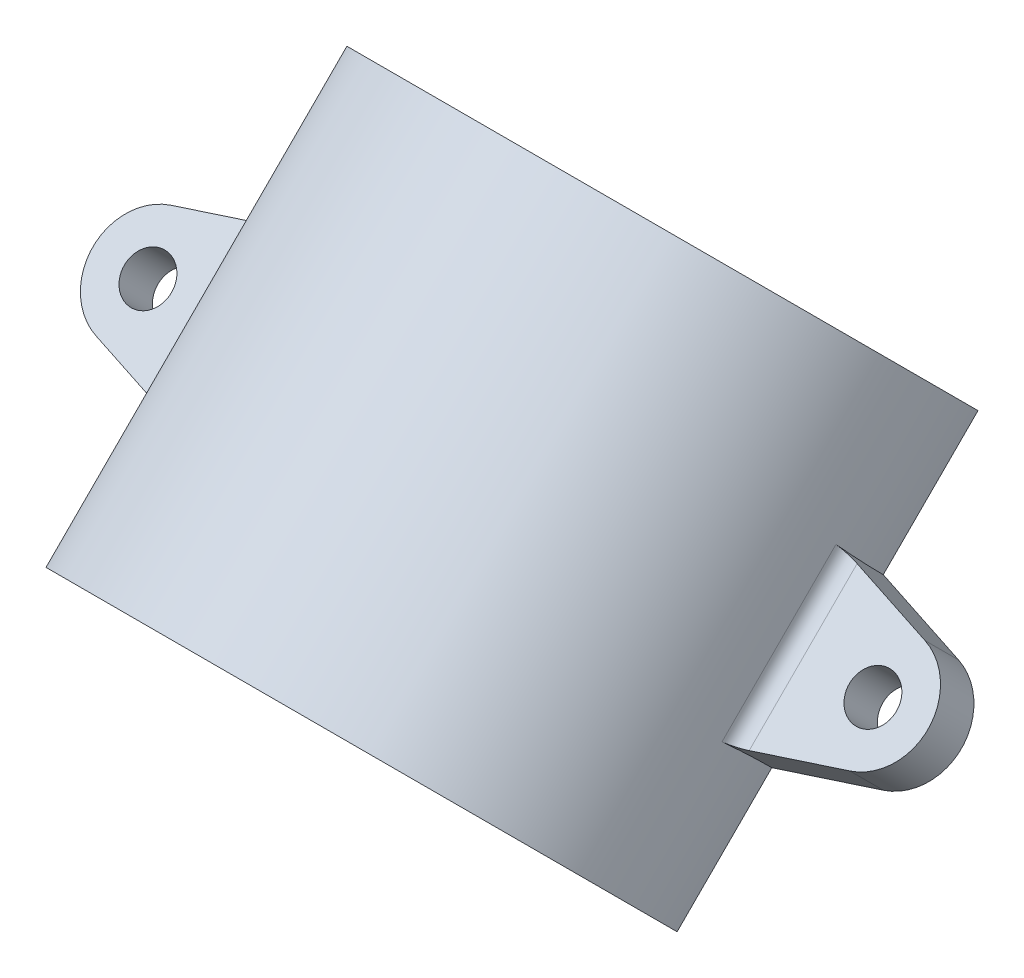
ISO-10303-21;
HEADER;
FILE_DESCRIPTION(('STEP AP214'),'2;1');
FILE_NAME('part.step','',(''),(''),'','','');
FILE_SCHEMA(('AUTOMOTIVE_DESIGN { 1 0 10303 214 1 1 1 1 }'));
ENDSEC;
DATA;
#1=APPLICATION_CONTEXT('core data for automotive mechanical design processes');
#2=APPLICATION_PROTOCOL_DEFINITION('international standard','automotive_design',2000,#1);
#3=PRODUCT_CONTEXT('',#1,'mechanical');
#4=PRODUCT('Part','Part','',(#3));
#5=PRODUCT_RELATED_PRODUCT_CATEGORY('part','',(#4));
#6=PRODUCT_DEFINITION_FORMATION('','',#4);
#7=PRODUCT_DEFINITION_CONTEXT('part definition',#1,'design');
#8=PRODUCT_DEFINITION('design','',#6,#7);
#9=PRODUCT_DEFINITION_SHAPE('','',#8);
#10=(LENGTH_UNIT() NAMED_UNIT(*) SI_UNIT(.MILLI.,.METRE.));
#11=(NAMED_UNIT(*) PLANE_ANGLE_UNIT() SI_UNIT($,.RADIAN.));
#12=(NAMED_UNIT(*) SI_UNIT($,.STERADIAN.) SOLID_ANGLE_UNIT());
#13=UNCERTAINTY_MEASURE_WITH_UNIT(LENGTH_MEASURE(1.E-05),#10,'distance_accuracy_value','');
#14=(GEOMETRIC_REPRESENTATION_CONTEXT(3) GLOBAL_UNCERTAINTY_ASSIGNED_CONTEXT((#13)) GLOBAL_UNIT_ASSIGNED_CONTEXT((#10,
#11,#12)) REPRESENTATION_CONTEXT('',''));
#15=CARTESIAN_POINT('',(0.,0.,0.));
#16=DIRECTION('',(0.,0.,1.));
#17=DIRECTION('',(1.,0.,0.));
#18=AXIS2_PLACEMENT_3D('',#15,#16,#17);
#19=CARTESIAN_POINT('',(73.8446097676777,108.985634114134,75.6415226492367));
#20=DIRECTION('',(0.,0.70710678118655,-0.707106781186545));
#21=DIRECTION('',(0.,0.707106781186545,0.70710678118655));
#22=AXIS2_PLACEMENT_3D('',#19,#20,#21);
#23=CYLINDRICAL_SURFACE('',#22,17.9999999999999);
#24=CARTESIAN_POINT('',(73.8446097676778,154.017195423794,30.6099613395769));
#25=DIRECTION('',(0.264410286372221,-0.681941053339861,0.681941053339862));
#26=DIRECTION('',(0.964410286372227,0.186966306509284,-0.186966306509264));
#27=AXIS2_PLACEMENT_3D('',#24,#25,#26);
#28=ELLIPSE('',#27,18.6642555086276,17.9999999999999);
#29=CARTESIAN_POINT('',(55.844609767678,150.5276085076,34.09954825577));
#30=VERTEX_POINT('',#29);
#31=CARTESIAN_POINT('',(56.2480223372503,153.285379003756,36.7009028380806));
#32=VERTEX_POINT('',#31);
#33=EDGE_CURVE('E144',#30,#32,#28,.F.);
#34=ORIENTED_EDGE('',*,*,#33,.T.);
#35=DIRECTION('',(0.,0.70710678118655,-0.707106781186545));
#36=VECTOR('',#35,1.);
#37=CARTESIAN_POINT('',(56.2480223372503,111.665196653366,78.3210851884696));
#38=LINE('',#37,#36);
#39=CARTESIAN_POINT('',(56.2480223372503,146.057895278045,43.9283865637913));
#40=VERTEX_POINT('',#39);
#41=EDGE_CURVE('E251',#32,#40,#38,.F.);
#42=ORIENTED_EDGE('',*,*,#41,.T.);
#43=CARTESIAN_POINT('',(73.8446097676778,139.966953779541,44.6602029838292));
#44=DIRECTION('',(0.264410286372221,0.681941053339866,-0.681941053339857));
#45=DIRECTION('',(-0.964410286372227,0.186966306509266,-0.186966306509282));
#46=AXIS2_PLACEMENT_3D('',#43,#44,#45);
#47=ELLIPSE('',#46,18.6642555086276,17.9999999999999);
#48=CARTESIAN_POINT('',(55.844609767678,143.456540695734,41.1706160676354));
#49=VERTEX_POINT('',#48);
#50=EDGE_CURVE('E180',#40,#49,#47,.F.);
#51=ORIENTED_EDGE('',*,*,#50,.T.);
#52=DIRECTION('',(0.,0.70710678118655,-0.707106781186545));
#53=VECTOR('',#52,1.);
#54=CARTESIAN_POINT('',(55.8446097676779,108.985634114133,75.6415226492366));
#55=LINE('',#54,#53);
#56=CARTESIAN_POINT('',(55.8446097676779,137.446133055649,47.1810237077214));
#57=VERTEX_POINT('',#56);
#58=EDGE_CURVE('E218',#57,#49,#55,.T.);
#59=ORIENTED_EDGE('',*,*,#58,.F.);
#60=CARTESIAN_POINT('',(73.8446097676778,137.446133055649,47.1810237077214));
#61=DIRECTION('',(0.,0.70710678118655,-0.707106781186545));
#62=DIRECTION('',(0.,0.707106781186545,0.70710678118655));
#63=AXIS2_PLACEMENT_3D('',#60,#61,#62);
#64=CIRCLE('',#63,17.9999999999999);
#65=CARTESIAN_POINT('',(91.8446097676778,137.446133055649,47.1810237077214));
#66=VERTEX_POINT('',#65);
#67=EDGE_CURVE('E220',#66,#57,#64,.F.);
#68=ORIENTED_EDGE('',*,*,#67,.F.);
#69=DIRECTION('',(0.,0.70710678118655,-0.707106781186545));
#70=VECTOR('',#69,1.);
#71=CARTESIAN_POINT('',(91.8446097676778,108.985634114133,75.6415226492367));
#72=LINE('',#71,#70);
#73=CARTESIAN_POINT('',(91.8446097676778,143.456540695735,41.1706160676358));
#74=VERTEX_POINT('',#73);
#75=EDGE_CURVE('E241',#66,#74,#72,.T.);
#76=ORIENTED_EDGE('',*,*,#75,.T.);
#77=CARTESIAN_POINT('',(73.8446097676778,139.966953779541,44.6602029838294));
#78=DIRECTION('',(-0.26441028637223,0.681941053339859,-0.68194105333986));
#79=DIRECTION('',(0.964410286372224,0.186966306509291,-0.186966306509271));
#80=AXIS2_PLACEMENT_3D('',#77,#78,#79);
#81=ELLIPSE('',#80,18.6642555086276,17.9999999999999);
#82=CARTESIAN_POINT('',(91.4411971981051,146.057895278045,43.9283865637918));
#83=VERTEX_POINT('',#82);
#84=EDGE_CURVE('E209',#74,#83,#81,.F.);
#85=ORIENTED_EDGE('',*,*,#84,.T.);
#86=DIRECTION('',(0.,0.70710678118655,-0.707106781186545));
#87=VECTOR('',#86,1.);
#88=CARTESIAN_POINT('',(91.441197198105,111.665196653367,78.3210851884699));
#89=LINE('',#88,#87);
#90=CARTESIAN_POINT('',(91.4411971981051,153.285379003756,36.7009028380812));
#91=VERTEX_POINT('',#90);
#92=EDGE_CURVE('E248',#83,#91,#89,.T.);
#93=ORIENTED_EDGE('',*,*,#92,.T.);
#94=CARTESIAN_POINT('',(73.8446097676778,154.017195423792,30.6099613395784));
#95=DIRECTION('',(-0.264410286372134,-0.681941053339883,0.681941053339874));
#96=DIRECTION('',(-0.964410286372251,0.186966306509205,-0.186966306509221));
#97=AXIS2_PLACEMENT_3D('',#94,#95,#96);
#98=ELLIPSE('',#97,18.6642555086271,17.9999999999999);
#99=CARTESIAN_POINT('',(91.8446097676778,150.5276085076,34.0995482557707));
#100=VERTEX_POINT('',#99);
#101=EDGE_CURVE('E211',#91,#100,#98,.F.);
#102=ORIENTED_EDGE('',*,*,#101,.T.);
#103=CARTESIAN_POINT('',(91.8446097676778,156.538016147686,28.0891406156847));
#104=VERTEX_POINT('',#103);
#105=EDGE_CURVE('E234',#100,#104,#72,.T.);
#106=ORIENTED_EDGE('',*,*,#105,.T.);
#107=CARTESIAN_POINT('',(73.8446097676778,156.538016147686,28.0891406156847));
#108=DIRECTION('',(0.,0.70710678118655,-0.707106781186545));
#109=DIRECTION('',(0.,0.707106781186545,0.70710678118655));
#110=AXIS2_PLACEMENT_3D('',#107,#108,#109);
#111=CIRCLE('',#110,17.9999999999999);
#112=CARTESIAN_POINT('',(55.844609767678,156.538016147686,28.0891406156846));
#113=VERTEX_POINT('',#112);
#114=EDGE_CURVE('E214',#113,#104,#111,.T.);
#115=ORIENTED_EDGE('',*,*,#114,.F.);
#116=EDGE_CURVE('E236',#30,#113,#55,.T.);
#117=ORIENTED_EDGE('',*,*,#116,.F.);
#118=EDGE_LOOP('',(#34,#42,#51,#59,#68,#76,#85,#93,#102,#106,#115,#117));
#119=FACE_BOUND('',#118,.T.);
#120=ADVANCED_FACE('F37',(#119),#23,.T.);
#121=CARTESIAN_POINT('',(58.8446097676777,108.985634114133,75.6415226492366));
#122=DIRECTION('',(0.,-0.707106781186545,-0.70710678118655));
#123=DIRECTION('',(0.,0.70710678118655,-0.707106781186545));
#124=AXIS2_PLACEMENT_3D('',#121,#122,#123);
#125=PLANE('',#124);
#126=DIRECTION('',(-1.,0.,0.));
#127=VECTOR('',#126,1.);
#128=CARTESIAN_POINT('',(58.8446097676778,156.538016147686,28.0891406156846));
#129=LINE('',#128,#127);
#130=CARTESIAN_POINT('',(58.8446097676774,156.538016147686,28.0891406156846));
#131=VERTEX_POINT('',#130);
#132=EDGE_CURVE('E231',#131,#113,#129,.T.);
#133=ORIENTED_EDGE('',*,*,#132,.F.);
#134=DIRECTION('',(0.,0.70710678118655,-0.707106781186545));
#135=VECTOR('',#134,1.);
#136=CARTESIAN_POINT('',(58.8446097676774,108.985634114133,75.6415226492366));
#137=LINE('',#136,#135);
#138=CARTESIAN_POINT('',(58.8446097676774,137.446133055649,47.1810237077214));
#139=VERTEX_POINT('',#138);
#140=EDGE_CURVE('E237',#139,#131,#137,.T.);
#141=ORIENTED_EDGE('',*,*,#140,.F.);
#142=DIRECTION('',(1.,0.,0.));
#143=VECTOR('',#142,1.);
#144=CARTESIAN_POINT('',(58.8446097676777,137.446133055649,47.1810237077214));
#145=LINE('',#144,#143);
#146=EDGE_CURVE('E217',#57,#139,#145,.T.);
#147=ORIENTED_EDGE('',*,*,#146,.F.);
#148=ORIENTED_EDGE('',*,*,#58,.T.);
#149=DIRECTION('',(0.964410286372227,-0.186966306509267,0.186966306509282));
#150=VECTOR('',#149,1.);
#151=CARTESIAN_POINT('',(49.9191737653752,144.605280914977,40.0218758483922));
#152=LINE('',#151,#150);
#153=CARTESIAN_POINT('',(49.9191737653752,144.605280914977,40.0218758483922));
#154=VERTEX_POINT('',#153);
#155=EDGE_CURVE('E148',#154,#49,#152,.T.);
#156=ORIENTED_EDGE('',*,*,#155,.F.);
#157=CARTESIAN_POINT('',(50.844609767678,146.992074601667,37.6350821617026));
#158=DIRECTION('',(0.,0.707106781186545,0.70710678118655));
#159=DIRECTION('',(0.,-0.70710678118655,0.707106781186545));
#160=AXIS2_PLACEMENT_3D('',#157,#158,#159);
#161=CIRCLE('',#160,3.50000000000002);
#162=CARTESIAN_POINT('',(49.9191737653752,149.378868288357,35.2482884750131));
#163=VERTEX_POINT('',#162);
#164=EDGE_CURVE('E155',#163,#154,#161,.T.);
#165=ORIENTED_EDGE('',*,*,#164,.F.);
#166=DIRECTION('',(-0.964410286372227,-0.186966306509283,0.186966306509266));
#167=VECTOR('',#166,1.);
#168=CARTESIAN_POINT('',(58.844609767678,151.109206326965,33.5179504364044));
#169=LINE('',#168,#167);
#170=EDGE_CURVE('E137',#30,#163,#169,.T.);
#171=ORIENTED_EDGE('',*,*,#170,.F.);
#172=ORIENTED_EDGE('',*,*,#116,.T.);
#173=EDGE_LOOP('',(#133,#141,#147,#148,#156,#165,#171,#172));
#174=FACE_BOUND('',#173,.T.);
#175=CARTESIAN_POINT('',(50.844609767678,146.992074601667,37.6350821617026));
#176=DIRECTION('',(0.,0.707106781186545,0.70710678118655));
#177=DIRECTION('',(0.,-0.70710678118655,0.707106781186545));
#178=AXIS2_PLACEMENT_3D('',#175,#176,#177);
#179=CIRCLE('',#178,1.50000000000001);
#180=CARTESIAN_POINT('',(50.844609767678,145.931414429887,38.6957423334825));
#181=VERTEX_POINT('',#180);
#182=EDGE_CURVE('E168',#181,#181,#179,.T.);
#183=ORIENTED_EDGE('',*,*,#182,.T.);
#184=EDGE_LOOP('',(#183));
#185=FACE_BOUND('',#184,.T.);
#186=ADVANCED_FACE('F161',(#174,#185),#125,.T.);
#187=CARTESIAN_POINT('',(73.8446097676774,108.985634114134,75.6415226492368));
#188=DIRECTION('',(0.,0.70710678118655,-0.707106781186545));
#189=DIRECTION('',(0.,0.707106781186545,0.70710678118655));
#190=AXIS2_PLACEMENT_3D('',#187,#188,#189);
#191=CYLINDRICAL_SURFACE('',#190,15.);
#192=CARTESIAN_POINT('',(73.8446097676774,137.446133055649,47.1810237077215));
#193=DIRECTION('',(0.,0.70710678118655,-0.707106781186545));
#194=DIRECTION('',(0.,0.707106781186545,0.70710678118655));
#195=AXIS2_PLACEMENT_3D('',#192,#193,#194);
#196=CIRCLE('',#195,15.);
#197=CARTESIAN_POINT('',(88.8446097676778,137.446133055649,47.1810237077214));
#198=VERTEX_POINT('',#197);
#199=EDGE_CURVE('E215',#139,#198,#196,.T.);
#200=ORIENTED_EDGE('',*,*,#199,.F.);
#201=ORIENTED_EDGE('',*,*,#140,.T.);
#202=CARTESIAN_POINT('',(73.8446097676774,156.538016147686,28.0891406156848));
#203=DIRECTION('',(0.,-0.70710678118655,0.707106781186545));
#204=DIRECTION('',(0.,0.707106781186545,0.70710678118655));
#205=AXIS2_PLACEMENT_3D('',#202,#203,#204);
#206=CIRCLE('',#205,15.);
#207=CARTESIAN_POINT('',(88.8446097676778,156.538016147686,28.0891406156847));
#208=VERTEX_POINT('',#207);
#209=EDGE_CURVE('E228',#208,#131,#206,.T.);
#210=ORIENTED_EDGE('',*,*,#209,.F.);
#211=DIRECTION('',(0.,0.70710678118655,-0.707106781186545));
#212=VECTOR('',#211,1.);
#213=CARTESIAN_POINT('',(88.8446097676778,108.985634114133,75.6415226492367));
#214=LINE('',#213,#212);
#215=EDGE_CURVE('E239',#198,#208,#214,.T.);
#216=ORIENTED_EDGE('',*,*,#215,.F.);
#217=EDGE_LOOP('',(#200,#201,#210,#216));
#218=FACE_BOUND('',#217,.T.);
#219=ADVANCED_FACE('F291',(#218),#191,.F.);
#220=CARTESIAN_POINT('',(91.8446097676778,108.985634114133,75.6415226492367));
#221=DIRECTION('',(0.,-0.707106781186545,-0.70710678118655));
#222=DIRECTION('',(0.,0.70710678118655,-0.707106781186545));
#223=AXIS2_PLACEMENT_3D('',#220,#221,#222);
#224=PLANE('',#223);
#225=ORIENTED_EDGE('',*,*,#215,.T.);
#226=DIRECTION('',(-1.,0.,0.));
#227=VECTOR('',#226,1.);
#228=CARTESIAN_POINT('',(91.8446097676778,156.538016147686,28.0891406156847));
#229=LINE('',#228,#227);
#230=EDGE_CURVE('E225',#104,#208,#229,.T.);
#231=ORIENTED_EDGE('',*,*,#230,.F.);
#232=ORIENTED_EDGE('',*,*,#105,.F.);
#233=DIRECTION('',(-0.96441028637225,0.186966306509205,-0.18696630650922));
#234=VECTOR('',#233,1.);
#235=CARTESIAN_POINT('',(97.7700457699808,149.378868288357,35.2482884750136));
#236=LINE('',#235,#234);
#237=CARTESIAN_POINT('',(97.7700457699808,149.378868288357,35.2482884750136));
#238=VERTEX_POINT('',#237);
#239=EDGE_CURVE('E201',#238,#100,#236,.T.);
#240=ORIENTED_EDGE('',*,*,#239,.F.);
#241=CARTESIAN_POINT('',(96.844609767678,146.992074601667,37.6350821617031));
#242=DIRECTION('',(0.,0.707106781186545,0.70710678118655));
#243=DIRECTION('',(0.,-0.70710678118655,0.707106781186545));
#244=AXIS2_PLACEMENT_3D('',#241,#242,#243);
#245=CIRCLE('',#244,3.5);
#246=CARTESIAN_POINT('',(97.7700457699808,144.605280914978,40.0218758483926));
#247=VERTEX_POINT('',#246);
#248=EDGE_CURVE('E187',#247,#238,#245,.T.);
#249=ORIENTED_EDGE('',*,*,#248,.F.);
#250=DIRECTION('',(0.964410286372224,0.186966306509291,-0.186966306509271));
#251=VECTOR('',#250,1.);
#252=CARTESIAN_POINT('',(88.8446097676778,142.874942876369,41.7522138870014));
#253=LINE('',#252,#251);
#254=EDGE_CURVE('E194',#74,#247,#253,.T.);
#255=ORIENTED_EDGE('',*,*,#254,.F.);
#256=ORIENTED_EDGE('',*,*,#75,.F.);
#257=DIRECTION('',(1.,0.,0.));
#258=VECTOR('',#257,1.);
#259=CARTESIAN_POINT('',(91.8446097676778,137.446133055649,47.1810237077214));
#260=LINE('',#259,#258);
#261=EDGE_CURVE('E222',#198,#66,#260,.T.);
#262=ORIENTED_EDGE('',*,*,#261,.F.);
#263=EDGE_LOOP('',(#225,#231,#232,#240,#249,#255,#256,#262));
#264=FACE_BOUND('',#263,.T.);
#265=CARTESIAN_POINT('',(96.844609767678,146.992074601667,37.6350821617031));
#266=DIRECTION('',(0.,0.707106781186545,0.70710678118655));
#267=DIRECTION('',(0.,-0.70710678118655,0.707106781186545));
#268=AXIS2_PLACEMENT_3D('',#265,#266,#267);
#269=CIRCLE('',#268,1.5);
#270=CARTESIAN_POINT('',(96.844609767678,145.931414429888,38.6957423334829));
#271=VERTEX_POINT('',#270);
#272=EDGE_CURVE('E183',#271,#271,#269,.T.);
#273=ORIENTED_EDGE('',*,*,#272,.T.);
#274=EDGE_LOOP('',(#273));
#275=FACE_BOUND('',#274,.T.);
#276=ADVANCED_FACE('F271',(#264,#275),#224,.T.);
#277=CARTESIAN_POINT('',(73.8446097676778,156.538016147686,28.0891406156847));
#278=DIRECTION('',(0.,0.70710678118655,-0.707106781186545));
#279=DIRECTION('',(0.,0.707106781186545,0.70710678118655));
#280=AXIS2_PLACEMENT_3D('',#277,#278,#279);
#281=PLANE('',#280);
#282=ORIENTED_EDGE('',*,*,#114,.T.);
#283=ORIENTED_EDGE('',*,*,#230,.T.);
#284=ORIENTED_EDGE('',*,*,#209,.T.);
#285=ORIENTED_EDGE('',*,*,#132,.T.);
#286=EDGE_LOOP('',(#282,#283,#284,#285));
#287=FACE_BOUND('',#286,.T.);
#288=ADVANCED_FACE('F285',(#287),#281,.T.);
#289=CARTESIAN_POINT('',(73.8446097676775,137.446133055649,47.1810237077216));
#290=DIRECTION('',(0.,0.70710678118655,-0.707106781186545));
#291=DIRECTION('',(0.,0.707106781186545,0.70710678118655));
#292=AXIS2_PLACEMENT_3D('',#289,#290,#291);
#293=PLANE('',#292);
#294=ORIENTED_EDGE('',*,*,#67,.T.);
#295=ORIENTED_EDGE('',*,*,#146,.T.);
#296=ORIENTED_EDGE('',*,*,#199,.T.);
#297=ORIENTED_EDGE('',*,*,#261,.T.);
#298=EDGE_LOOP('',(#294,#295,#296,#297));
#299=FACE_BOUND('',#298,.T.);
#300=ADVANCED_FACE('F294',(#299),#293,.F.);
#301=CARTESIAN_POINT('',(96.844609767678,149.113394945227,39.7564025052627));
#302=DIRECTION('',(0.,0.707106781186545,0.70710678118655));
#303=DIRECTION('',(0.,-0.70710678118655,0.707106781186545));
#304=AXIS2_PLACEMENT_3D('',#301,#302,#303);
#305=PLANE('',#304);
#306=DIRECTION('',(-0.96441028637225,0.186966306509205,-0.18696630650922));
#307=VECTOR('',#306,1.);
#308=CARTESIAN_POINT('',(97.7700457699807,151.500188631917,37.3696088185732));
#309=LINE('',#308,#307);
#310=CARTESIAN_POINT('',(97.7700457699807,151.500188631917,37.3696088185732));
#311=VERTEX_POINT('',#310);
#312=CARTESIAN_POINT('',(92.4187853886844,152.537615754789,36.3321816957004));
#313=VERTEX_POINT('',#312);
#314=EDGE_CURVE('E193',#311,#313,#309,.T.);
#315=ORIENTED_EDGE('',*,*,#314,.T.);
#316=DIRECTION('',(0.,-0.70710678118655,0.707106781186545));
#317=VECTOR('',#316,1.);
#318=CARTESIAN_POINT('',(92.4187853886844,145.529053224144,43.3407442263454));
#319=LINE('',#318,#317);
#320=CARTESIAN_POINT('',(92.4187853886844,145.689174135664,43.1806233148253));
#321=VERTEX_POINT('',#320);
#322=EDGE_CURVE('E254',#313,#321,#319,.T.);
#323=ORIENTED_EDGE('',*,*,#322,.T.);
#324=DIRECTION('',(0.964410286372224,0.186966306509291,-0.186966306509271));
#325=VECTOR('',#324,1.);
#326=CARTESIAN_POINT('',(88.8446097676778,144.996263219929,43.873534230561));
#327=LINE('',#326,#325);
#328=CARTESIAN_POINT('',(97.7700457699807,146.726601258538,42.1431961919522));
#329=VERTEX_POINT('',#328);
#330=EDGE_CURVE('E196',#321,#329,#327,.T.);
#331=ORIENTED_EDGE('',*,*,#330,.T.);
#332=CARTESIAN_POINT('',(96.844609767678,149.113394945227,39.7564025052627));
#333=DIRECTION('',(0.,0.707106781186545,0.70710678118655));
#334=DIRECTION('',(0.,-0.70710678118655,0.707106781186545));
#335=AXIS2_PLACEMENT_3D('',#332,#333,#334);
#336=CIRCLE('',#335,3.5);
#337=EDGE_CURVE('E190',#329,#311,#336,.T.);
#338=ORIENTED_EDGE('',*,*,#337,.T.);
#339=EDGE_LOOP('',(#315,#323,#331,#338));
#340=FACE_BOUND('',#339,.T.);
#341=CARTESIAN_POINT('',(96.844609767678,149.113394945227,39.7564025052627));
#342=DIRECTION('',(0.,0.707106781186545,0.70710678118655));
#343=DIRECTION('',(0.,-0.70710678118655,0.707106781186545));
#344=AXIS2_PLACEMENT_3D('',#341,#342,#343);
#345=CIRCLE('',#344,1.5);
#346=CARTESIAN_POINT('',(96.844609767678,148.052734773447,40.8170626770425));
#347=VERTEX_POINT('',#346);
#348=EDGE_CURVE('E184',#347,#347,#345,.T.);
#349=ORIENTED_EDGE('',*,*,#348,.F.);
#350=EDGE_LOOP('',(#349));
#351=FACE_BOUND('',#350,.T.);
#352=ADVANCED_FACE('F279',(#340,#351),#305,.T.);
#353=CARTESIAN_POINT('',(96.844609767678,149.113394945227,39.7564025052627));
#354=DIRECTION('',(0.,-0.707106781186545,-0.70710678118655));
#355=DIRECTION('',(0.,0.70710678118655,-0.707106781186545));
#356=AXIS2_PLACEMENT_3D('',#353,#354,#355);
#357=CYLINDRICAL_SURFACE('',#356,3.5);
#358=ORIENTED_EDGE('',*,*,#248,.T.);
#359=DIRECTION('',(0.,-0.707106781186545,-0.70710678118655));
#360=VECTOR('',#359,1.);
#361=CARTESIAN_POINT('',(97.7700457699807,151.500188631917,37.3696088185732));
#362=LINE('',#361,#360);
#363=EDGE_CURVE('E206',#311,#238,#362,.T.);
#364=ORIENTED_EDGE('',*,*,#363,.F.);
#365=ORIENTED_EDGE('',*,*,#337,.F.);
#366=DIRECTION('',(0.,-0.707106781186545,-0.70710678118655));
#367=VECTOR('',#366,1.);
#368=CARTESIAN_POINT('',(97.7700457699807,146.726601258538,42.1431961919522));
#369=LINE('',#368,#367);
#370=EDGE_CURVE('E198',#329,#247,#369,.T.);
#371=ORIENTED_EDGE('',*,*,#370,.T.);
#372=EDGE_LOOP('',(#358,#364,#365,#371));
#373=FACE_BOUND('',#372,.T.);
#374=ADVANCED_FACE('F276',(#373),#357,.T.);
#375=CARTESIAN_POINT('',(97.7700457699807,151.500188631917,37.3696088185732));
#376=DIRECTION('',(-0.264410286372134,-0.681941053339883,0.681941053339874));
#377=DIRECTION('',(0.,-0.707106781186543,-0.707106781186552));
#378=AXIS2_PLACEMENT_3D('',#375,#376,#377);
#379=PLANE('',#378);
#380=ORIENTED_EDGE('',*,*,#101,.F.);
#381=CARTESIAN_POINT('',(92.4187853886844,153.244722535976,37.039288476887));
#382=DIRECTION('',(-0.264410286372134,-0.681941053339883,0.681941053339874));
#383=DIRECTION('',(-0.964410286372251,0.186966306509205,-0.186966306509221));
#384=AXIS2_PLACEMENT_3D('',#381,#382,#383);
#385=ELLIPSE('',#384,1.03690308381262,1.);
#386=EDGE_CURVE('E11',#91,#313,#385,.T.);
#387=ORIENTED_EDGE('',*,*,#386,.T.);
#388=ORIENTED_EDGE('',*,*,#314,.F.);
#389=ORIENTED_EDGE('',*,*,#363,.T.);
#390=ORIENTED_EDGE('',*,*,#239,.T.);
#391=EDGE_LOOP('',(#380,#387,#388,#389,#390));
#392=FACE_BOUND('',#391,.T.);
#393=ADVANCED_FACE('F281',(#392),#379,.F.);
#394=CARTESIAN_POINT('',(88.8446097676778,144.996263219929,43.873534230561));
#395=DIRECTION('',(-0.26441028637223,0.681941053339859,-0.68194105333986));
#396=DIRECTION('',(0.,0.707106781186548,0.707106781186547));
#397=AXIS2_PLACEMENT_3D('',#394,#395,#396);
#398=PLANE('',#397);
#399=ORIENTED_EDGE('',*,*,#84,.F.);
#400=ORIENTED_EDGE('',*,*,#254,.T.);
#401=ORIENTED_EDGE('',*,*,#370,.F.);
#402=ORIENTED_EDGE('',*,*,#330,.F.);
#403=CARTESIAN_POINT('',(92.4187853886844,146.396280916851,43.8877300960119));
#404=DIRECTION('',(-0.26441028637223,0.681941053339859,-0.68194105333986));
#405=DIRECTION('',(0.964410286372224,0.186966306509291,-0.186966306509271));
#406=AXIS2_PLACEMENT_3D('',#403,#404,#405);
#407=ELLIPSE('',#406,1.03690308381265,1.);
#408=EDGE_CURVE('E45',#321,#83,#407,.T.);
#409=ORIENTED_EDGE('',*,*,#408,.T.);
#410=EDGE_LOOP('',(#399,#400,#401,#402,#409));
#411=FACE_BOUND('',#410,.T.);
#412=ADVANCED_FACE('F261',(#411),#398,.F.);
#413=CARTESIAN_POINT('',(96.844609767678,149.113394945227,39.7564025052627));
#414=DIRECTION('',(0.,-0.707106781186545,-0.70710678118655));
#415=DIRECTION('',(0.,0.70710678118655,-0.707106781186545));
#416=AXIS2_PLACEMENT_3D('',#413,#414,#415);
#417=CYLINDRICAL_SURFACE('',#416,1.5);
#418=ORIENTED_EDGE('',*,*,#348,.T.);
#419=EDGE_LOOP('',(#418));
#420=FACE_BOUND('',#419,.T.);
#421=ORIENTED_EDGE('',*,*,#272,.F.);
#422=EDGE_LOOP('',(#421));
#423=FACE_BOUND('',#422,.T.);
#424=ADVANCED_FACE('F344',(#420,#423),#417,.F.);
#425=CARTESIAN_POINT('',(49.9191737653751,146.726601258537,42.1431961919518));
#426=DIRECTION('',(0.264410286372221,0.681941053339866,-0.681941053339857));
#427=DIRECTION('',(0.,0.707106781186543,0.707106781186552));
#428=AXIS2_PLACEMENT_3D('',#425,#426,#427);
#429=PLANE('',#428);
#430=ORIENTED_EDGE('',*,*,#50,.F.);
#431=CARTESIAN_POINT('',(55.270434146671,146.396280916851,43.8877300960114));
#432=DIRECTION('',(0.264410286372221,0.681941053339866,-0.681941053339857));
#433=DIRECTION('',(-0.964410286372227,0.186966306509266,-0.186966306509282));
#434=AXIS2_PLACEMENT_3D('',#431,#432,#433);
#435=ELLIPSE('',#434,1.03690308381265,1.);
#436=CARTESIAN_POINT('',(55.270434146671,145.689174135664,43.1806233148249));
#437=VERTEX_POINT('',#436);
#438=EDGE_CURVE('E258',#40,#437,#435,.T.);
#439=ORIENTED_EDGE('',*,*,#438,.T.);
#440=DIRECTION('',(0.964410286372227,-0.186966306509267,0.186966306509282));
#441=VECTOR('',#440,1.);
#442=CARTESIAN_POINT('',(49.9191737653751,146.726601258537,42.1431961919518));
#443=LINE('',#442,#441);
#444=CARTESIAN_POINT('',(49.9191737653751,146.726601258537,42.1431961919518));
#445=VERTEX_POINT('',#444);
#446=EDGE_CURVE('E173',#445,#437,#443,.T.);
#447=ORIENTED_EDGE('',*,*,#446,.F.);
#448=DIRECTION('',(0.,-0.707106781186545,-0.70710678118655));
#449=VECTOR('',#448,1.);
#450=CARTESIAN_POINT('',(49.9191737653751,146.726601258537,42.1431961919518));
#451=LINE('',#450,#449);
#452=EDGE_CURVE('E158',#445,#154,#451,.T.);
#453=ORIENTED_EDGE('',*,*,#452,.T.);
#454=ORIENTED_EDGE('',*,*,#155,.T.);
#455=EDGE_LOOP('',(#430,#439,#447,#453,#454));
#456=FACE_BOUND('',#455,.T.);
#457=ADVANCED_FACE('F326',(#456),#429,.F.);
#458=CARTESIAN_POINT('',(58.8446097676779,153.230526670525,35.6392707799641));
#459=DIRECTION('',(0.264410286372221,-0.681941053339861,0.681941053339862));
#460=DIRECTION('',(0.,-0.707106781186548,-0.707106781186547));
#461=AXIS2_PLACEMENT_3D('',#458,#459,#460);
#462=PLANE('',#461);
#463=ORIENTED_EDGE('',*,*,#33,.F.);
#464=ORIENTED_EDGE('',*,*,#170,.T.);
#465=DIRECTION('',(0.,-0.707106781186545,-0.70710678118655));
#466=VECTOR('',#465,1.);
#467=CARTESIAN_POINT('',(49.9191737653751,151.500188631916,37.3696088185728));
#468=LINE('',#467,#466);
#469=CARTESIAN_POINT('',(49.9191737653751,151.500188631916,37.3696088185728));
#470=VERTEX_POINT('',#469);
#471=EDGE_CURVE('E141',#470,#163,#468,.T.);
#472=ORIENTED_EDGE('',*,*,#471,.F.);
#473=DIRECTION('',(-0.964410286372227,-0.186966306509283,0.186966306509266));
#474=VECTOR('',#473,1.);
#475=CARTESIAN_POINT('',(58.8446097676779,153.230526670525,35.6392707799641));
#476=LINE('',#475,#474);
#477=CARTESIAN_POINT('',(55.270434146671,152.537615754789,36.3321816956998));
#478=VERTEX_POINT('',#477);
#479=EDGE_CURVE('E157',#478,#470,#476,.T.);
#480=ORIENTED_EDGE('',*,*,#479,.F.);
#481=CARTESIAN_POINT('',(55.270434146671,153.244722535976,37.0392884768863));
#482=DIRECTION('',(0.264410286372221,-0.681941053339861,0.681941053339862));
#483=DIRECTION('',(0.964410286372227,0.186966306509284,-0.186966306509264));
#484=AXIS2_PLACEMENT_3D('',#481,#482,#483);
#485=ELLIPSE('',#484,1.03690308381265,1.);
#486=EDGE_CURVE('E256',#478,#32,#485,.T.);
#487=ORIENTED_EDGE('',*,*,#486,.T.);
#488=EDGE_LOOP('',(#463,#464,#472,#480,#487));
#489=FACE_BOUND('',#488,.T.);
#490=ADVANCED_FACE('F139',(#489),#462,.F.);
#491=CARTESIAN_POINT('',(50.8446097676779,149.113394945227,39.7564025052623));
#492=DIRECTION('',(0.,0.707106781186545,0.70710678118655));
#493=DIRECTION('',(0.,-0.70710678118655,0.707106781186545));
#494=AXIS2_PLACEMENT_3D('',#491,#492,#493);
#495=PLANE('',#494);
#496=ORIENTED_EDGE('',*,*,#446,.T.);
#497=DIRECTION('',(0.,-0.70710678118655,0.707106781186545));
#498=VECTOR('',#497,1.);
#499=CARTESIAN_POINT('',(55.270434146671,152.697736666309,36.1720607841797));
#500=LINE('',#499,#498);
#501=EDGE_CURVE('E245',#437,#478,#500,.F.);
#502=ORIENTED_EDGE('',*,*,#501,.T.);
#503=ORIENTED_EDGE('',*,*,#479,.T.);
#504=CARTESIAN_POINT('',(50.8446097676779,149.113394945227,39.7564025052623));
#505=DIRECTION('',(0.,0.707106781186545,0.70710678118655));
#506=DIRECTION('',(0.,-0.70710678118655,0.707106781186545));
#507=AXIS2_PLACEMENT_3D('',#504,#505,#506);
#508=CIRCLE('',#507,3.50000000000002);
#509=EDGE_CURVE('E149',#470,#445,#508,.T.);
#510=ORIENTED_EDGE('',*,*,#509,.T.);
#511=EDGE_LOOP('',(#496,#502,#503,#510));
#512=FACE_BOUND('',#511,.T.);
#513=CARTESIAN_POINT('',(50.8446097676779,149.113394945227,39.7564025052623));
#514=DIRECTION('',(0.,0.707106781186545,0.70710678118655));
#515=DIRECTION('',(0.,-0.70710678118655,0.707106781186545));
#516=AXIS2_PLACEMENT_3D('',#513,#514,#515);
#517=CIRCLE('',#516,1.50000000000001);
#518=CARTESIAN_POINT('',(50.8446097676779,148.052734773447,40.8170626770421));
#519=VERTEX_POINT('',#518);
#520=EDGE_CURVE('E165',#519,#519,#517,.T.);
#521=ORIENTED_EDGE('',*,*,#520,.F.);
#522=EDGE_LOOP('',(#521));
#523=FACE_BOUND('',#522,.T.);
#524=ADVANCED_FACE('F328',(#512,#523),#495,.T.);
#525=CARTESIAN_POINT('',(50.8446097676779,149.113394945227,39.7564025052623));
#526=DIRECTION('',(0.,-0.707106781186545,-0.70710678118655));
#527=DIRECTION('',(0.,0.70710678118655,-0.707106781186545));
#528=AXIS2_PLACEMENT_3D('',#525,#526,#527);
#529=CYLINDRICAL_SURFACE('',#528,3.50000000000002);
#530=ORIENTED_EDGE('',*,*,#164,.T.);
#531=ORIENTED_EDGE('',*,*,#452,.F.);
#532=ORIENTED_EDGE('',*,*,#509,.F.);
#533=ORIENTED_EDGE('',*,*,#471,.T.);
#534=EDGE_LOOP('',(#530,#531,#532,#533));
#535=FACE_BOUND('',#534,.T.);
#536=ADVANCED_FACE('F153',(#535),#529,.T.);
#537=CARTESIAN_POINT('',(50.8446097676779,149.113394945227,39.7564025052623));
#538=DIRECTION('',(0.,-0.707106781186545,-0.70710678118655));
#539=DIRECTION('',(0.,0.70710678118655,-0.707106781186545));
#540=AXIS2_PLACEMENT_3D('',#537,#538,#539);
#541=CYLINDRICAL_SURFACE('',#540,1.50000000000001);
#542=ORIENTED_EDGE('',*,*,#520,.T.);
#543=EDGE_LOOP('',(#542));
#544=FACE_BOUND('',#543,.T.);
#545=ORIENTED_EDGE('',*,*,#182,.F.);
#546=EDGE_LOOP('',(#545));
#547=FACE_BOUND('',#546,.T.);
#548=ADVANCED_FACE('F314',(#544,#547),#541,.F.);
#549=CARTESIAN_POINT('',(55.270434146671,111.814061238879,78.4699497739825));
#550=DIRECTION('',(0.,0.70710678118655,-0.707106781186545));
#551=DIRECTION('',(0.,0.707106781186545,0.70710678118655));
#552=AXIS2_PLACEMENT_3D('',#549,#550,#551);
#553=CYLINDRICAL_SURFACE('',#552,1.);
#554=ORIENTED_EDGE('',*,*,#438,.F.);
#555=ORIENTED_EDGE('',*,*,#41,.F.);
#556=ORIENTED_EDGE('',*,*,#486,.F.);
#557=ORIENTED_EDGE('',*,*,#501,.F.);
#558=EDGE_LOOP('',(#554,#555,#556,#557));
#559=FACE_BOUND('',#558,.T.);
#560=ADVANCED_FACE('F312',(#559),#553,.F.);
#561=CARTESIAN_POINT('',(92.4187853886844,111.81406123888,78.4699497739829));
#562=DIRECTION('',(0.,0.70710678118655,-0.707106781186545));
#563=DIRECTION('',(0.,0.707106781186545,0.70710678118655));
#564=AXIS2_PLACEMENT_3D('',#561,#562,#563);
#565=CYLINDRICAL_SURFACE('',#564,1.);
#566=ORIENTED_EDGE('',*,*,#386,.F.);
#567=ORIENTED_EDGE('',*,*,#92,.F.);
#568=ORIENTED_EDGE('',*,*,#408,.F.);
#569=ORIENTED_EDGE('',*,*,#322,.F.);
#570=EDGE_LOOP('',(#566,#567,#568,#569));
#571=FACE_BOUND('',#570,.T.);
#572=ADVANCED_FACE('F39',(#571),#565,.F.);
#573=CLOSED_SHELL('',(#120,#186,#219,#276,#288,#300,#352,#374,#393,#412,#424,#457,#490,#524,
#536,#548,#560,#572));
#574=MANIFOLD_SOLID_BREP('B2',#573);
#575=ADVANCED_BREP_SHAPE_REPRESENTATION('',(#18,#574),#14);
#576=SHAPE_DEFINITION_REPRESENTATION(#9,#575);
ENDSEC;
END-ISO-10303-21;
